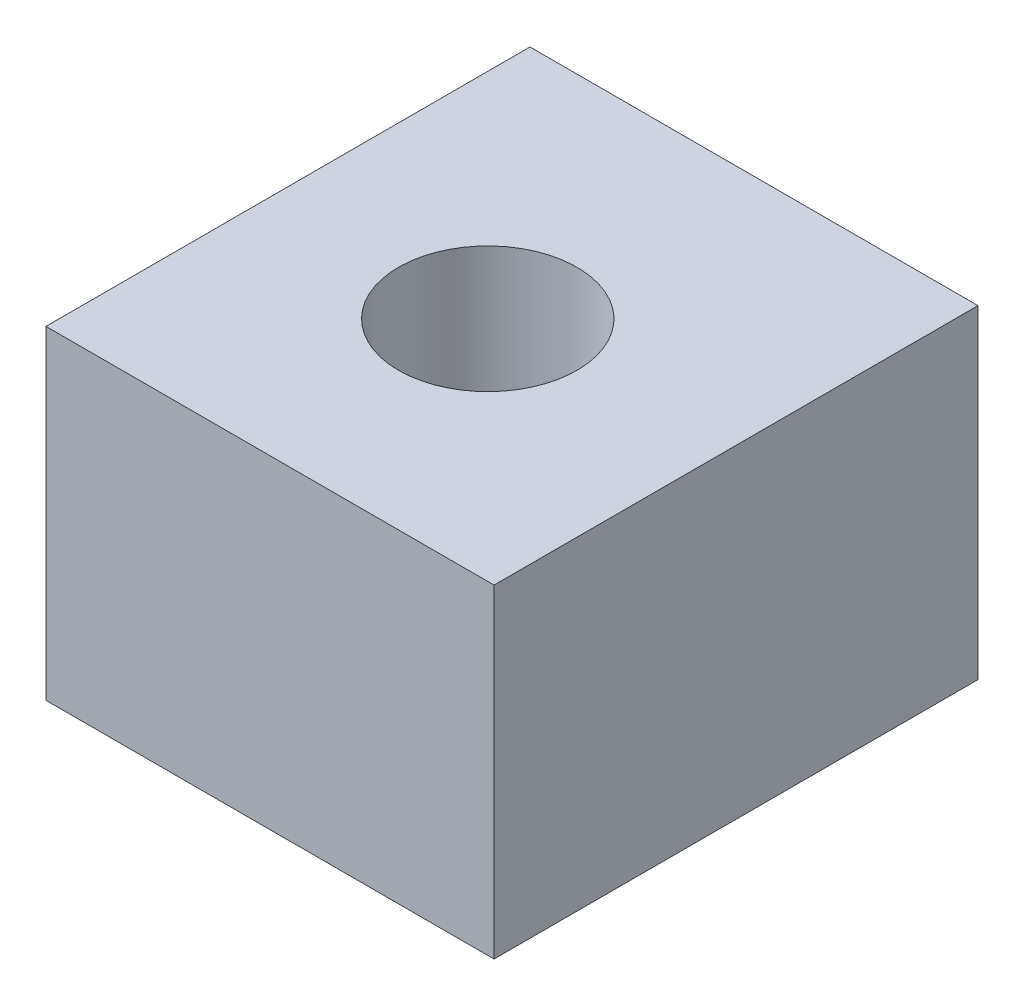
ISO-10303-21;
HEADER;
FILE_DESCRIPTION(('STEP AP214'),'2;1');
FILE_NAME('part.step','',(''),(''),'','','');
FILE_SCHEMA(('AUTOMOTIVE_DESIGN { 1 0 10303 214 1 1 1 1 }'));
ENDSEC;
DATA;
#1=APPLICATION_CONTEXT('core data for automotive mechanical design processes');
#2=APPLICATION_PROTOCOL_DEFINITION('international standard','automotive_design',2000,#1);
#3=PRODUCT_CONTEXT('',#1,'mechanical');
#4=PRODUCT('Part','Part','',(#3));
#5=PRODUCT_RELATED_PRODUCT_CATEGORY('part','',(#4));
#6=PRODUCT_DEFINITION_FORMATION('','',#4);
#7=PRODUCT_DEFINITION_CONTEXT('part definition',#1,'design');
#8=PRODUCT_DEFINITION('design','',#6,#7);
#9=PRODUCT_DEFINITION_SHAPE('','',#8);
#10=(LENGTH_UNIT() NAMED_UNIT(*) SI_UNIT(.MILLI.,.METRE.));
#11=(NAMED_UNIT(*) PLANE_ANGLE_UNIT() SI_UNIT($,.RADIAN.));
#12=(NAMED_UNIT(*) SI_UNIT($,.STERADIAN.) SOLID_ANGLE_UNIT());
#13=UNCERTAINTY_MEASURE_WITH_UNIT(LENGTH_MEASURE(1.E-05),#10,'distance_accuracy_value','');
#14=(GEOMETRIC_REPRESENTATION_CONTEXT(3) GLOBAL_UNCERTAINTY_ASSIGNED_CONTEXT((#13)) GLOBAL_UNIT_ASSIGNED_CONTEXT((#10,
#11,#12)) REPRESENTATION_CONTEXT('',''));
#15=CARTESIAN_POINT('',(0.,0.,0.));
#16=DIRECTION('',(0.,0.,1.));
#17=DIRECTION('',(1.,0.,0.));
#18=AXIS2_PLACEMENT_3D('',#15,#16,#17);
#19=CARTESIAN_POINT('',(0.,0.,93.472));
#20=DIRECTION('',(1.,0.,0.));
#21=DIRECTION('',(0.,0.,-1.));
#22=AXIS2_PLACEMENT_3D('',#19,#20,#21);
#23=PLANE('',#22);
#24=DIRECTION('',(0.,-1.,0.));
#25=VECTOR('',#24,1.);
#26=CARTESIAN_POINT('',(0.,0.,0.));
#27=LINE('',#26,#25);
#28=CARTESIAN_POINT('',(0.,0.,0.));
#29=VERTEX_POINT('',#28);
#30=CARTESIAN_POINT('',(0.,-62.5551870208593,0.));
#31=VERTEX_POINT('',#30);
#32=EDGE_CURVE('E104',#29,#31,#27,.T.);
#33=ORIENTED_EDGE('',*,*,#32,.T.);
#34=DIRECTION('',(0.,0.,-1.));
#35=VECTOR('',#34,1.);
#36=CARTESIAN_POINT('',(0.,-62.5551870208593,93.472));
#37=LINE('',#36,#35);
#38=CARTESIAN_POINT('',(0.,-62.5551870208593,93.472));
#39=VERTEX_POINT('',#38);
#40=EDGE_CURVE('E11',#39,#31,#37,.T.);
#41=ORIENTED_EDGE('',*,*,#40,.F.);
#42=DIRECTION('',(0.,-1.,0.));
#43=VECTOR('',#42,1.);
#44=CARTESIAN_POINT('',(0.,0.,93.472));
#45=LINE('',#44,#43);
#46=CARTESIAN_POINT('',(0.,0.,93.472));
#47=VERTEX_POINT('',#46);
#48=EDGE_CURVE('E92',#47,#39,#45,.T.);
#49=ORIENTED_EDGE('',*,*,#48,.F.);
#50=DIRECTION('',(0.,0.,-1.));
#51=VECTOR('',#50,1.);
#52=CARTESIAN_POINT('',(0.,0.,93.472));
#53=LINE('',#52,#51);
#54=EDGE_CURVE('E100',#47,#29,#53,.T.);
#55=ORIENTED_EDGE('',*,*,#54,.T.);
#56=EDGE_LOOP('',(#33,#41,#49,#55));
#57=FACE_BOUND('',#56,.T.);
#58=ADVANCED_FACE('F41',(#57),#23,.F.);
#59=CARTESIAN_POINT('',(0.,-62.5551870208593,93.472));
#60=DIRECTION('',(0.,1.,0.));
#61=DIRECTION('',(0.,0.,1.));
#62=AXIS2_PLACEMENT_3D('',#59,#60,#61);
#63=PLANE('',#62);
#64=CARTESIAN_POINT('',(41.3919014581552,-62.5551870208593,49.5413431378324));
#65=DIRECTION('',(0.,1.,0.));
#66=DIRECTION('',(0.,0.,1.));
#67=AXIS2_PLACEMENT_3D('',#64,#65,#66);
#68=CIRCLE('',#67,17.2420156532098);
#69=CARTESIAN_POINT('',(41.3919014581552,-62.5551870208593,66.7833587910422));
#70=VERTEX_POINT('',#69);
#71=EDGE_CURVE('E107',#70,#70,#68,.T.);
#72=ORIENTED_EDGE('',*,*,#71,.T.);
#73=EDGE_LOOP('',(#72));
#74=FACE_BOUND('',#73,.T.);
#75=DIRECTION('',(1.,0.,0.));
#76=VECTOR('',#75,1.);
#77=CARTESIAN_POINT('',(0.,-62.5551870208593,0.));
#78=LINE('',#77,#76);
#79=CARTESIAN_POINT('',(86.5324428596898,-62.5551870208593,0.));
#80=VERTEX_POINT('',#79);
#81=EDGE_CURVE('E96',#31,#80,#78,.T.);
#82=ORIENTED_EDGE('',*,*,#81,.T.);
#83=DIRECTION('',(0.,0.,-1.));
#84=VECTOR('',#83,1.);
#85=CARTESIAN_POINT('',(86.5324428596898,-62.5551870208593,93.472));
#86=LINE('',#85,#84);
#87=CARTESIAN_POINT('',(86.5324428596898,-62.5551870208593,93.472));
#88=VERTEX_POINT('',#87);
#89=EDGE_CURVE('E49',#88,#80,#86,.T.);
#90=ORIENTED_EDGE('',*,*,#89,.F.);
#91=DIRECTION('',(1.,0.,0.));
#92=VECTOR('',#91,1.);
#93=CARTESIAN_POINT('',(0.,-62.5551870208593,93.472));
#94=LINE('',#93,#92);
#95=EDGE_CURVE('E87',#39,#88,#94,.T.);
#96=ORIENTED_EDGE('',*,*,#95,.F.);
#97=ORIENTED_EDGE('',*,*,#40,.T.);
#98=EDGE_LOOP('',(#82,#90,#96,#97));
#99=FACE_BOUND('',#98,.T.);
#100=ADVANCED_FACE('F95',(#74,#99),#63,.F.);
#101=CARTESIAN_POINT('',(86.5324428596898,0.,93.472));
#102=DIRECTION('',(-1.,0.,0.));
#103=DIRECTION('',(0.,0.,1.));
#104=AXIS2_PLACEMENT_3D('',#101,#102,#103);
#105=PLANE('',#104);
#106=DIRECTION('',(0.,1.,0.));
#107=VECTOR('',#106,1.);
#108=CARTESIAN_POINT('',(86.5324428596898,0.,0.));
#109=LINE('',#108,#107);
#110=CARTESIAN_POINT('',(86.5324428596898,0.,0.));
#111=VERTEX_POINT('',#110);
#112=EDGE_CURVE('E74',#80,#111,#109,.T.);
#113=ORIENTED_EDGE('',*,*,#112,.T.);
#114=DIRECTION('',(0.,0.,-1.));
#115=VECTOR('',#114,1.);
#116=CARTESIAN_POINT('',(86.5324428596898,0.,93.472));
#117=LINE('',#116,#115);
#118=CARTESIAN_POINT('',(86.5324428596898,0.,93.472));
#119=VERTEX_POINT('',#118);
#120=EDGE_CURVE('E97',#119,#111,#117,.T.);
#121=ORIENTED_EDGE('',*,*,#120,.F.);
#122=DIRECTION('',(0.,1.,0.));
#123=VECTOR('',#122,1.);
#124=CARTESIAN_POINT('',(86.5324428596898,0.,93.472));
#125=LINE('',#124,#123);
#126=EDGE_CURVE('E90',#88,#119,#125,.T.);
#127=ORIENTED_EDGE('',*,*,#126,.F.);
#128=ORIENTED_EDGE('',*,*,#89,.T.);
#129=EDGE_LOOP('',(#113,#121,#127,#128));
#130=FACE_BOUND('',#129,.T.);
#131=ADVANCED_FACE('F98',(#130),#105,.F.);
#132=CARTESIAN_POINT('',(0.,0.,93.472));
#133=DIRECTION('',(0.,-1.,0.));
#134=DIRECTION('',(0.,0.,-1.));
#135=AXIS2_PLACEMENT_3D('',#132,#133,#134);
#136=PLANE('',#135);
#137=CARTESIAN_POINT('',(41.3919014581552,0.,49.5413431378324));
#138=DIRECTION('',(0.,1.,0.));
#139=DIRECTION('',(0.,0.,1.));
#140=AXIS2_PLACEMENT_3D('',#137,#138,#139);
#141=CIRCLE('',#140,17.2420156532098);
#142=CARTESIAN_POINT('',(41.3919014581552,0.,66.7833587910422));
#143=VERTEX_POINT('',#142);
#144=EDGE_CURVE('E120',#143,#143,#141,.T.);
#145=ORIENTED_EDGE('',*,*,#144,.F.);
#146=EDGE_LOOP('',(#145));
#147=FACE_BOUND('',#146,.T.);
#148=DIRECTION('',(-1.,0.,0.));
#149=VECTOR('',#148,1.);
#150=CARTESIAN_POINT('',(0.,0.,0.));
#151=LINE('',#150,#149);
#152=EDGE_CURVE('E80',#111,#29,#151,.T.);
#153=ORIENTED_EDGE('',*,*,#152,.T.);
#154=ORIENTED_EDGE('',*,*,#54,.F.);
#155=DIRECTION('',(-1.,0.,0.));
#156=VECTOR('',#155,1.);
#157=CARTESIAN_POINT('',(0.,0.,93.472));
#158=LINE('',#157,#156);
#159=EDGE_CURVE('E57',#119,#47,#158,.T.);
#160=ORIENTED_EDGE('',*,*,#159,.F.);
#161=ORIENTED_EDGE('',*,*,#120,.T.);
#162=EDGE_LOOP('',(#153,#154,#160,#161));
#163=FACE_BOUND('',#162,.T.);
#164=ADVANCED_FACE('F112',(#147,#163),#136,.F.);
#165=CARTESIAN_POINT('',(0.,0.,93.472));
#166=DIRECTION('',(0.,0.,1.));
#167=DIRECTION('',(1.,0.,0.));
#168=AXIS2_PLACEMENT_3D('',#165,#166,#167);
#169=PLANE('',#168);
#170=ORIENTED_EDGE('',*,*,#48,.T.);
#171=ORIENTED_EDGE('',*,*,#95,.T.);
#172=ORIENTED_EDGE('',*,*,#126,.T.);
#173=ORIENTED_EDGE('',*,*,#159,.T.);
#174=EDGE_LOOP('',(#170,#171,#172,#173));
#175=FACE_BOUND('',#174,.T.);
#176=ADVANCED_FACE('F88',(#175),#169,.T.);
#177=CARTESIAN_POINT('',(0.,0.,0.));
#178=DIRECTION('',(0.,0.,1.));
#179=DIRECTION('',(1.,0.,0.));
#180=AXIS2_PLACEMENT_3D('',#177,#178,#179);
#181=PLANE('',#180);
#182=ORIENTED_EDGE('',*,*,#32,.F.);
#183=ORIENTED_EDGE('',*,*,#152,.F.);
#184=ORIENTED_EDGE('',*,*,#112,.F.);
#185=ORIENTED_EDGE('',*,*,#81,.F.);
#186=EDGE_LOOP('',(#182,#183,#184,#185));
#187=FACE_BOUND('',#186,.T.);
#188=ADVANCED_FACE('F115',(#187),#181,.F.);
#189=CARTESIAN_POINT('',(41.3919014581552,-93.472,49.5413431378324));
#190=DIRECTION('',(0.,1.,0.));
#191=DIRECTION('',(0.,0.,1.));
#192=AXIS2_PLACEMENT_3D('',#189,#190,#191);
#193=CYLINDRICAL_SURFACE('',#192,17.2420156532098);
#194=ORIENTED_EDGE('',*,*,#144,.T.);
#195=EDGE_LOOP('',(#194));
#196=FACE_BOUND('',#195,.T.);
#197=ORIENTED_EDGE('',*,*,#71,.F.);
#198=EDGE_LOOP('',(#197));
#199=FACE_BOUND('',#198,.T.);
#200=ADVANCED_FACE('F124',(#196,#199),#193,.F.);
#201=CLOSED_SHELL('',(#58,#100,#131,#164,#176,#188,#200));
#202=MANIFOLD_SOLID_BREP('B2',#201);
#203=ADVANCED_BREP_SHAPE_REPRESENTATION('',(#18,#202),#14);
#204=SHAPE_DEFINITION_REPRESENTATION(#9,#203);
ENDSEC;
END-ISO-10303-21;
